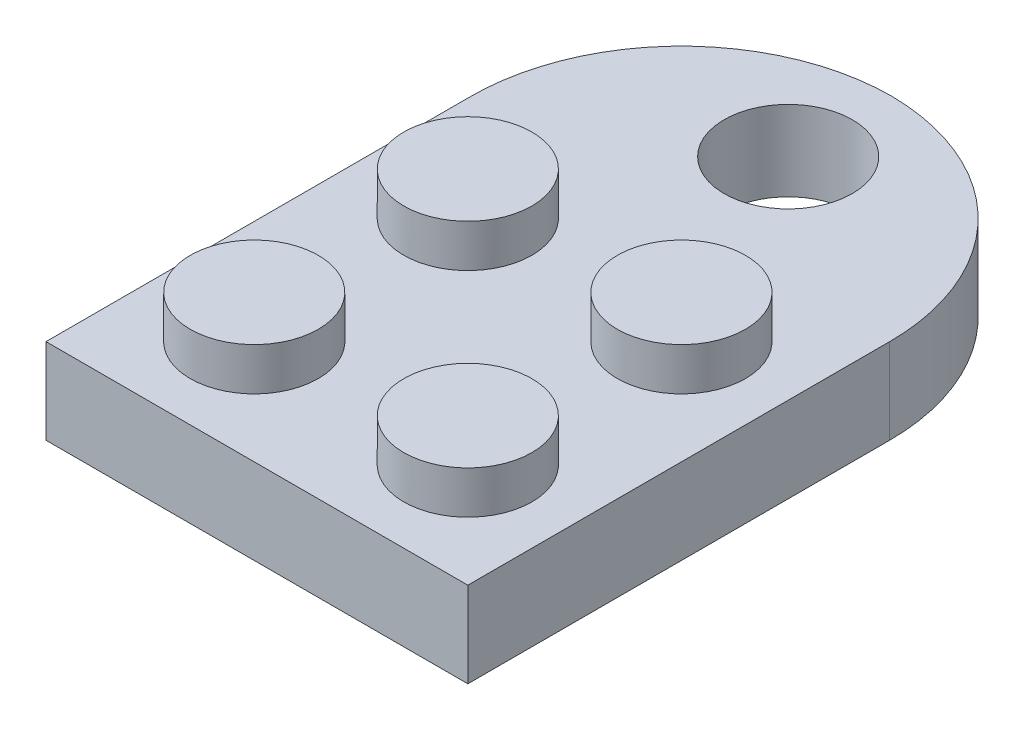
ISO-10303-21;
HEADER;
FILE_DESCRIPTION(('STEP AP214'),'2;1');
FILE_NAME('part.step','',(''),(''),'','','');
FILE_SCHEMA(('AUTOMOTIVE_DESIGN { 1 0 10303 214 1 1 1 1 }'));
ENDSEC;
DATA;
#1=APPLICATION_CONTEXT('core data for automotive mechanical design processes');
#2=APPLICATION_PROTOCOL_DEFINITION('international standard','automotive_design',2000,#1);
#3=PRODUCT_CONTEXT('',#1,'mechanical');
#4=PRODUCT('Part','Part','',(#3));
#5=PRODUCT_RELATED_PRODUCT_CATEGORY('part','',(#4));
#6=PRODUCT_DEFINITION_FORMATION('','',#4);
#7=PRODUCT_DEFINITION_CONTEXT('part definition',#1,'design');
#8=PRODUCT_DEFINITION('design','',#6,#7);
#9=PRODUCT_DEFINITION_SHAPE('','',#8);
#10=(LENGTH_UNIT() NAMED_UNIT(*) SI_UNIT(.MILLI.,.METRE.));
#11=(NAMED_UNIT(*) PLANE_ANGLE_UNIT() SI_UNIT($,.RADIAN.));
#12=(NAMED_UNIT(*) SI_UNIT($,.STERADIAN.) SOLID_ANGLE_UNIT());
#13=UNCERTAINTY_MEASURE_WITH_UNIT(LENGTH_MEASURE(1.E-05),#10,'distance_accuracy_value','');
#14=(GEOMETRIC_REPRESENTATION_CONTEXT(3) GLOBAL_UNCERTAINTY_ASSIGNED_CONTEXT((#13)) GLOBAL_UNIT_ASSIGNED_CONTEXT((#10,
#11,#12)) REPRESENTATION_CONTEXT('',''));
#15=CARTESIAN_POINT('',(0.,0.,0.));
#16=DIRECTION('',(0.,0.,1.));
#17=DIRECTION('',(1.,0.,0.));
#18=AXIS2_PLACEMENT_3D('',#15,#16,#17);
#19=CARTESIAN_POINT('',(9.2650879384945,2.4,-7.9));
#20=DIRECTION('',(0.,-1.,0.));
#21=DIRECTION('',(0.,0.,-1.));
#22=AXIS2_PLACEMENT_3D('',#19,#20,#21);
#23=PLANE('',#22);
#24=CARTESIAN_POINT('',(8.58196721311474,2.4,-12.));
#25=DIRECTION('',(0.,-1.,0.));
#26=DIRECTION('',(0.,0.,-1.));
#27=AXIS2_PLACEMENT_3D('',#24,#25,#26);
#28=CIRCLE('',#27,3.25);
#29=CARTESIAN_POINT('',(9.62071922922984,2.4,-15.0795282510503));
#30=VERTEX_POINT('',#29);
#31=CARTESIAN_POINT('',(7.54321519699964,2.4,-15.0795282510503));
#32=VERTEX_POINT('',#31);
#33=EDGE_CURVE('E174',#30,#32,#28,.T.);
#34=ORIENTED_EDGE('',*,*,#33,.F.);
#35=CARTESIAN_POINT('',(7.89884648773498,2.4,-7.9));
#36=DIRECTION('',(0.,1.,0.));
#37=DIRECTION('',(0.,0.,1.));
#38=AXIS2_PLACEMENT_3D('',#35,#36,#37);
#39=CIRCLE('',#38,7.38312072537976);
#40=CARTESIAN_POINT('',(15.2819672131147,2.4,-7.9));
#41=VERTEX_POINT('',#40);
#42=EDGE_CURVE('E188',#41,#30,#39,.T.);
#43=ORIENTED_EDGE('',*,*,#42,.F.);
#44=DIRECTION('',(-1.,0.,0.));
#45=VECTOR('',#44,1.);
#46=CARTESIAN_POINT('',(15.2819672131147,2.4,-7.9));
#47=LINE('',#46,#45);
#48=CARTESIAN_POINT('',(1.88196721311474,2.4,-7.9));
#49=VERTEX_POINT('',#48);
#50=EDGE_CURVE('E179',#41,#49,#47,.T.);
#51=ORIENTED_EDGE('',*,*,#50,.T.);
#52=CARTESIAN_POINT('',(9.2650879384945,2.4,-7.9));
#53=DIRECTION('',(0.,-1.,0.));
#54=DIRECTION('',(0.,0.,-1.));
#55=AXIS2_PLACEMENT_3D('',#52,#53,#54);
#56=CIRCLE('',#55,7.38312072537976);
#57=EDGE_CURVE('E184',#49,#32,#56,.T.);
#58=ORIENTED_EDGE('',*,*,#57,.T.);
#59=EDGE_LOOP('',(#34,#43,#51,#58));
#60=FACE_BOUND('',#59,.T.);
#61=ADVANCED_FACE('F41',(#60),#23,.T.);
#62=CARTESIAN_POINT('',(8.58196721311474,4.8,-12.));
#63=DIRECTION('',(0.,-1.,0.));
#64=DIRECTION('',(0.,0.,-1.));
#65=AXIS2_PLACEMENT_3D('',#62,#63,#64);
#66=CYLINDRICAL_SURFACE('',#65,2.4);
#67=CARTESIAN_POINT('',(8.58196721311474,3.2,-12.));
#68=DIRECTION('',(0.,-1.,0.));
#69=DIRECTION('',(1.,0.,0.));
#70=AXIS2_PLACEMENT_3D('',#67,#68,#69);
#71=CIRCLE('',#70,2.4);
#72=CARTESIAN_POINT('',(10.9819672131147,3.2,-12.));
#73=VERTEX_POINT('',#72);
#74=EDGE_CURVE('E199',#73,#73,#71,.T.);
#75=ORIENTED_EDGE('',*,*,#74,.F.);
#76=EDGE_LOOP('',(#75));
#77=FACE_BOUND('',#76,.T.);
#78=CARTESIAN_POINT('',(8.58196721311474,0.2,-12.));
#79=DIRECTION('',(0.,-1.,0.));
#80=DIRECTION('',(0.,0.,-1.));
#81=AXIS2_PLACEMENT_3D('',#78,#79,#80);
#82=CIRCLE('',#81,2.4);
#83=CARTESIAN_POINT('',(8.58196721311474,0.2,-14.4));
#84=VERTEX_POINT('',#83);
#85=EDGE_CURVE('E169',#84,#84,#82,.T.);
#86=ORIENTED_EDGE('',*,*,#85,.T.);
#87=EDGE_LOOP('',(#86));
#88=FACE_BOUND('',#87,.T.);
#89=ADVANCED_FACE('F357',(#77,#88),#66,.F.);
#90=CARTESIAN_POINT('',(0.681967213114738,0.,7.9));
#91=DIRECTION('',(0.,1.,0.));
#92=DIRECTION('',(0.,0.,1.));
#93=AXIS2_PLACEMENT_3D('',#90,#91,#92);
#94=PLANE('',#93);
#95=CARTESIAN_POINT('',(9.2650879384945,0.,-7.9));
#96=DIRECTION('',(0.,-1.,0.));
#97=DIRECTION('',(0.,0.,-1.));
#98=AXIS2_PLACEMENT_3D('',#95,#96,#97);
#99=CIRCLE('',#98,7.38312072537976);
#100=CARTESIAN_POINT('',(1.88196721311474,0.,-7.9));
#101=VERTEX_POINT('',#100);
#102=CARTESIAN_POINT('',(8.58196721311474,0.,-15.2514500420046));
#103=VERTEX_POINT('',#102);
#104=EDGE_CURVE('E192',#101,#103,#99,.T.);
#105=ORIENTED_EDGE('',*,*,#104,.F.);
#106=DIRECTION('',(-1.,0.,0.));
#107=VECTOR('',#106,1.);
#108=CARTESIAN_POINT('',(15.2819672131147,0.,-7.9));
#109=LINE('',#108,#107);
#110=CARTESIAN_POINT('',(15.2819672131147,0.,-7.9));
#111=VERTEX_POINT('',#110);
#112=EDGE_CURVE('E64',#111,#101,#109,.T.);
#113=ORIENTED_EDGE('',*,*,#112,.F.);
#114=CARTESIAN_POINT('',(7.89884648773498,0.,-7.9));
#115=DIRECTION('',(0.,1.,0.));
#116=DIRECTION('',(0.,0.,1.));
#117=AXIS2_PLACEMENT_3D('',#114,#115,#116);
#118=CIRCLE('',#117,7.38312072537976);
#119=EDGE_CURVE('E183',#111,#103,#118,.T.);
#120=ORIENTED_EDGE('',*,*,#119,.T.);
#121=EDGE_LOOP('',(#105,#113,#120));
#122=FACE_BOUND('',#121,.T.);
#123=DIRECTION('',(0.,0.,-1.));
#124=VECTOR('',#123,1.);
#125=CARTESIAN_POINT('',(0.681967213114738,0.,7.9));
#126=LINE('',#125,#124);
#127=CARTESIAN_POINT('',(0.681967213114738,0.,7.9));
#128=VERTEX_POINT('',#127);
#129=CARTESIAN_POINT('',(0.681967213114738,0.,-7.9));
#130=VERTEX_POINT('',#129);
#131=EDGE_CURVE('E305',#128,#130,#126,.T.);
#132=ORIENTED_EDGE('',*,*,#131,.T.);
#133=CARTESIAN_POINT('',(8.58196721311474,0.,-7.999375));
#134=DIRECTION('',(0.,1.,0.));
#135=DIRECTION('',(0.,0.,1.));
#136=AXIS2_PLACEMENT_3D('',#133,#134,#135);
#137=CIRCLE('',#136,7.900625);
#138=CARTESIAN_POINT('',(8.58196721311474,0.,-15.9));
#139=VERTEX_POINT('',#138);
#140=EDGE_CURVE('E203',#139,#130,#137,.T.);
#141=ORIENTED_EDGE('',*,*,#140,.F.);
#142=CARTESIAN_POINT('',(8.48133430172233,0.,-7.9));
#143=DIRECTION('',(0.,1.,0.));
#144=DIRECTION('',(0.,0.,1.));
#145=AXIS2_PLACEMENT_3D('',#142,#143,#144);
#146=CIRCLE('',#145,8.00063291139241);
#147=CARTESIAN_POINT('',(16.4819672131147,0.,-7.9));
#148=VERTEX_POINT('',#147);
#149=EDGE_CURVE('E205',#148,#139,#146,.T.);
#150=ORIENTED_EDGE('',*,*,#149,.F.);
#151=DIRECTION('',(0.,0.,-1.));
#152=VECTOR('',#151,1.);
#153=CARTESIAN_POINT('',(16.4819672131147,0.,7.9));
#154=LINE('',#153,#152);
#155=CARTESIAN_POINT('',(16.4819672131147,0.,7.9));
#156=VERTEX_POINT('',#155);
#157=EDGE_CURVE('E302',#156,#148,#154,.T.);
#158=ORIENTED_EDGE('',*,*,#157,.F.);
#159=DIRECTION('',(1.,0.,0.));
#160=VECTOR('',#159,1.);
#161=CARTESIAN_POINT('',(0.681967213114738,0.,7.9));
#162=LINE('',#161,#160);
#163=EDGE_CURVE('E285',#128,#156,#162,.T.);
#164=ORIENTED_EDGE('',*,*,#163,.F.);
#165=EDGE_LOOP('',(#132,#141,#150,#158,#164));
#166=FACE_BOUND('',#165,.T.);
#167=DIRECTION('',(1.,0.,0.));
#168=VECTOR('',#167,1.);
#169=CARTESIAN_POINT('',(0.,0.,-6.7));
#170=LINE('',#169,#168);
#171=CARTESIAN_POINT('',(1.88196721311474,0.,-6.7));
#172=VERTEX_POINT('',#171);
#173=CARTESIAN_POINT('',(15.2819672131147,0.,-6.7));
#174=VERTEX_POINT('',#173);
#175=EDGE_CURVE('E259',#172,#174,#170,.T.);
#176=ORIENTED_EDGE('',*,*,#175,.F.);
#177=DIRECTION('',(0.,0.,-1.));
#178=VECTOR('',#177,1.);
#179=CARTESIAN_POINT('',(1.88196721311474,0.,7.9));
#180=LINE('',#179,#178);
#181=CARTESIAN_POINT('',(1.88196721311474,0.,6.7));
#182=VERTEX_POINT('',#181);
#183=EDGE_CURVE('E237',#182,#172,#180,.T.);
#184=ORIENTED_EDGE('',*,*,#183,.F.);
#185=DIRECTION('',(1.,0.,0.));
#186=VECTOR('',#185,1.);
#187=CARTESIAN_POINT('',(0.,0.,6.7));
#188=LINE('',#187,#186);
#189=CARTESIAN_POINT('',(15.2819672131147,0.,6.7));
#190=VERTEX_POINT('',#189);
#191=EDGE_CURVE('E262',#182,#190,#188,.T.);
#192=ORIENTED_EDGE('',*,*,#191,.T.);
#193=DIRECTION('',(0.,0.,-1.));
#194=VECTOR('',#193,1.);
#195=CARTESIAN_POINT('',(15.2819672131147,0.,7.9));
#196=LINE('',#195,#194);
#197=EDGE_CURVE('E251',#190,#174,#196,.T.);
#198=ORIENTED_EDGE('',*,*,#197,.T.);
#199=EDGE_LOOP('',(#176,#184,#192,#198));
#200=FACE_BOUND('',#199,.T.);
#201=ADVANCED_FACE('F348',(#122,#166,#200),#94,.F.);
#202=CARTESIAN_POINT('',(12.5819672131147,4.8,4.));
#203=DIRECTION('',(0.,1.,0.));
#204=DIRECTION('',(0.,0.,1.));
#205=AXIS2_PLACEMENT_3D('',#202,#203,#204);
#206=PLANE('',#205);
#207=CARTESIAN_POINT('',(12.5819672131147,4.8,4.));
#208=DIRECTION('',(0.,1.,0.));
#209=DIRECTION('',(0.,0.,1.));
#210=AXIS2_PLACEMENT_3D('',#207,#208,#209);
#211=CIRCLE('',#210,2.4);
#212=CARTESIAN_POINT('',(12.5819672131147,4.8,6.4));
#213=VERTEX_POINT('',#212);
#214=EDGE_CURVE('E323',#213,#213,#211,.T.);
#215=ORIENTED_EDGE('',*,*,#214,.T.);
#216=EDGE_LOOP('',(#215));
#217=FACE_BOUND('',#216,.T.);
#218=ADVANCED_FACE('F43',(#217),#206,.T.);
#219=CARTESIAN_POINT('',(12.5819672131147,4.8,4.));
#220=DIRECTION('',(0.,-1.,0.));
#221=DIRECTION('',(0.,0.,-1.));
#222=AXIS2_PLACEMENT_3D('',#219,#220,#221);
#223=CYLINDRICAL_SURFACE('',#222,2.4);
#224=ORIENTED_EDGE('',*,*,#214,.F.);
#225=EDGE_LOOP('',(#224));
#226=FACE_BOUND('',#225,.T.);
#227=CARTESIAN_POINT('',(12.5819672131147,3.2,4.));
#228=DIRECTION('',(0.,-1.,0.));
#229=DIRECTION('',(1.,0.,0.));
#230=AXIS2_PLACEMENT_3D('',#227,#228,#229);
#231=CIRCLE('',#230,2.4);
#232=CARTESIAN_POINT('',(14.9819672131147,3.2,4.));
#233=VERTEX_POINT('',#232);
#234=EDGE_CURVE('E320',#233,#233,#231,.F.);
#235=ORIENTED_EDGE('',*,*,#234,.T.);
#236=EDGE_LOOP('',(#235));
#237=FACE_BOUND('',#236,.T.);
#238=ADVANCED_FACE('F499',(#226,#237),#223,.T.);
#239=CARTESIAN_POINT('',(12.5819672131147,4.8,-4.));
#240=DIRECTION('',(0.,1.,0.));
#241=DIRECTION('',(0.,0.,1.));
#242=AXIS2_PLACEMENT_3D('',#239,#240,#241);
#243=PLANE('',#242);
#244=CARTESIAN_POINT('',(12.5819672131147,4.8,-4.));
#245=DIRECTION('',(0.,1.,0.));
#246=DIRECTION('',(0.,0.,1.));
#247=AXIS2_PLACEMENT_3D('',#244,#245,#246);
#248=CIRCLE('',#247,2.4);
#249=CARTESIAN_POINT('',(12.5819672131147,4.8,-1.6));
#250=VERTEX_POINT('',#249);
#251=EDGE_CURVE('E317',#250,#250,#248,.T.);
#252=ORIENTED_EDGE('',*,*,#251,.T.);
#253=EDGE_LOOP('',(#252));
#254=FACE_BOUND('',#253,.T.);
#255=ADVANCED_FACE('F496',(#254),#243,.T.);
#256=CARTESIAN_POINT('',(12.5819672131147,4.8,-4.));
#257=DIRECTION('',(0.,-1.,0.));
#258=DIRECTION('',(0.,0.,-1.));
#259=AXIS2_PLACEMENT_3D('',#256,#257,#258);
#260=CYLINDRICAL_SURFACE('',#259,2.4);
#261=ORIENTED_EDGE('',*,*,#251,.F.);
#262=EDGE_LOOP('',(#261));
#263=FACE_BOUND('',#262,.T.);
#264=CARTESIAN_POINT('',(12.5819672131147,3.2,-4.));
#265=DIRECTION('',(0.,-1.,0.));
#266=DIRECTION('',(1.,0.,0.));
#267=AXIS2_PLACEMENT_3D('',#264,#265,#266);
#268=CIRCLE('',#267,2.4);
#269=CARTESIAN_POINT('',(14.9819672131147,3.2,-4.));
#270=VERTEX_POINT('',#269);
#271=EDGE_CURVE('E314',#270,#270,#268,.F.);
#272=ORIENTED_EDGE('',*,*,#271,.T.);
#273=EDGE_LOOP('',(#272));
#274=FACE_BOUND('',#273,.T.);
#275=ADVANCED_FACE('F492',(#263,#274),#260,.T.);
#276=CARTESIAN_POINT('',(0.681967213114738,0.,7.9));
#277=DIRECTION('',(1.,0.,0.));
#278=DIRECTION('',(0.,0.,-1.));
#279=AXIS2_PLACEMENT_3D('',#276,#277,#278);
#280=PLANE('',#279);
#281=DIRECTION('',(0.,-1.,0.));
#282=VECTOR('',#281,1.);
#283=CARTESIAN_POINT('',(0.681967213114738,0.,-7.9));
#284=LINE('',#283,#282);
#285=CARTESIAN_POINT('',(0.681967213114738,3.2,-7.9));
#286=VERTEX_POINT('',#285);
#287=EDGE_CURVE('E281',#286,#130,#284,.T.);
#288=ORIENTED_EDGE('',*,*,#287,.T.);
#289=ORIENTED_EDGE('',*,*,#131,.F.);
#290=DIRECTION('',(0.,-1.,0.));
#291=VECTOR('',#290,1.);
#292=CARTESIAN_POINT('',(0.681967213114738,0.,7.9));
#293=LINE('',#292,#291);
#294=CARTESIAN_POINT('',(0.681967213114738,3.2,7.9));
#295=VERTEX_POINT('',#294);
#296=EDGE_CURVE('E282',#295,#128,#293,.T.);
#297=ORIENTED_EDGE('',*,*,#296,.F.);
#298=DIRECTION('',(0.,0.,-1.));
#299=VECTOR('',#298,1.);
#300=CARTESIAN_POINT('',(0.681967213114738,3.2,7.9));
#301=LINE('',#300,#299);
#302=EDGE_CURVE('E292',#295,#286,#301,.T.);
#303=ORIENTED_EDGE('',*,*,#302,.T.);
#304=EDGE_LOOP('',(#288,#289,#297,#303));
#305=FACE_BOUND('',#304,.T.);
#306=ADVANCED_FACE('F486',(#305),#280,.F.);
#307=CARTESIAN_POINT('',(16.4819672131147,0.,7.9));
#308=DIRECTION('',(-1.,0.,0.));
#309=DIRECTION('',(0.,0.,1.));
#310=AXIS2_PLACEMENT_3D('',#307,#308,#309);
#311=PLANE('',#310);
#312=DIRECTION('',(0.,1.,0.));
#313=VECTOR('',#312,1.);
#314=CARTESIAN_POINT('',(16.4819672131147,0.,-7.9));
#315=LINE('',#314,#313);
#316=CARTESIAN_POINT('',(16.4819672131147,3.2,-7.9));
#317=VERTEX_POINT('',#316);
#318=EDGE_CURVE('E286',#148,#317,#315,.T.);
#319=ORIENTED_EDGE('',*,*,#318,.T.);
#320=DIRECTION('',(0.,0.,-1.));
#321=VECTOR('',#320,1.);
#322=CARTESIAN_POINT('',(16.4819672131147,3.2,7.9));
#323=LINE('',#322,#321);
#324=CARTESIAN_POINT('',(16.4819672131147,3.2,7.9));
#325=VERTEX_POINT('',#324);
#326=EDGE_CURVE('E299',#325,#317,#323,.T.);
#327=ORIENTED_EDGE('',*,*,#326,.F.);
#328=DIRECTION('',(0.,1.,0.));
#329=VECTOR('',#328,1.);
#330=CARTESIAN_POINT('',(16.4819672131147,0.,7.9));
#331=LINE('',#330,#329);
#332=EDGE_CURVE('E288',#156,#325,#331,.T.);
#333=ORIENTED_EDGE('',*,*,#332,.F.);
#334=ORIENTED_EDGE('',*,*,#157,.T.);
#335=EDGE_LOOP('',(#319,#327,#333,#334));
#336=FACE_BOUND('',#335,.T.);
#337=ADVANCED_FACE('F483',(#336),#311,.F.);
#338=CARTESIAN_POINT('',(0.681967213114738,3.2,7.9));
#339=DIRECTION('',(0.,-1.,0.));
#340=DIRECTION('',(1.,0.,0.));
#341=AXIS2_PLACEMENT_3D('',#338,#339,#340);
#342=PLANE('',#341);
#343=ORIENTED_EDGE('',*,*,#74,.T.);
#344=EDGE_LOOP('',(#343));
#345=FACE_BOUND('',#344,.T.);
#346=CARTESIAN_POINT('',(4.58196721311474,3.2,4.));
#347=DIRECTION('',(0.,-1.,0.));
#348=DIRECTION('',(1.,0.,0.));
#349=AXIS2_PLACEMENT_3D('',#346,#347,#348);
#350=CIRCLE('',#349,2.4);
#351=CARTESIAN_POINT('',(6.98196721311474,3.2,4.));
#352=VERTEX_POINT('',#351);
#353=EDGE_CURVE('E311',#352,#352,#350,.F.);
#354=ORIENTED_EDGE('',*,*,#353,.F.);
#355=EDGE_LOOP('',(#354));
#356=FACE_BOUND('',#355,.T.);
#357=CARTESIAN_POINT('',(4.58196721311474,3.2,-4.));
#358=DIRECTION('',(0.,-1.,0.));
#359=DIRECTION('',(1.,0.,0.));
#360=AXIS2_PLACEMENT_3D('',#357,#358,#359);
#361=CIRCLE('',#360,2.4);
#362=CARTESIAN_POINT('',(6.98196721311474,3.2,-4.));
#363=VERTEX_POINT('',#362);
#364=EDGE_CURVE('E308',#363,#363,#361,.F.);
#365=ORIENTED_EDGE('',*,*,#364,.F.);
#366=EDGE_LOOP('',(#365));
#367=FACE_BOUND('',#366,.T.);
#368=ORIENTED_EDGE('',*,*,#326,.T.);
#369=CARTESIAN_POINT('',(8.48133430172233,3.2,-7.9));
#370=DIRECTION('',(0.,1.,0.));
#371=DIRECTION('',(0.,0.,1.));
#372=AXIS2_PLACEMENT_3D('',#369,#370,#371);
#373=CIRCLE('',#372,8.00063291139241);
#374=CARTESIAN_POINT('',(8.58196721311474,3.2,-15.9));
#375=VERTEX_POINT('',#374);
#376=EDGE_CURVE('E208',#317,#375,#373,.T.);
#377=ORIENTED_EDGE('',*,*,#376,.T.);
#378=CARTESIAN_POINT('',(8.58196721311474,3.2,-7.999375));
#379=DIRECTION('',(0.,1.,0.));
#380=DIRECTION('',(0.,0.,1.));
#381=AXIS2_PLACEMENT_3D('',#378,#379,#380);
#382=CIRCLE('',#381,7.900625);
#383=EDGE_CURVE('E206',#375,#286,#382,.T.);
#384=ORIENTED_EDGE('',*,*,#383,.T.);
#385=ORIENTED_EDGE('',*,*,#302,.F.);
#386=DIRECTION('',(-1.,0.,0.));
#387=VECTOR('',#386,1.);
#388=CARTESIAN_POINT('',(0.681967213114738,3.2,7.9));
#389=LINE('',#388,#387);
#390=EDGE_CURVE('E290',#325,#295,#389,.T.);
#391=ORIENTED_EDGE('',*,*,#390,.F.);
#392=EDGE_LOOP('',(#368,#377,#384,#385,#391));
#393=FACE_BOUND('',#392,.T.);
#394=ORIENTED_EDGE('',*,*,#271,.F.);
#395=EDGE_LOOP('',(#394));
#396=FACE_BOUND('',#395,.T.);
#397=ORIENTED_EDGE('',*,*,#234,.F.);
#398=EDGE_LOOP('',(#397));
#399=FACE_BOUND('',#398,.T.);
#400=ADVANCED_FACE('F479',(#345,#356,#367,#393,#396,#399),#342,.F.);
#401=CARTESIAN_POINT('',(0.,0.,7.9));
#402=DIRECTION('',(0.,0.,-1.));
#403=DIRECTION('',(-1.,0.,0.));
#404=AXIS2_PLACEMENT_3D('',#401,#402,#403);
#405=PLANE('',#404);
#406=ORIENTED_EDGE('',*,*,#296,.T.);
#407=ORIENTED_EDGE('',*,*,#163,.T.);
#408=ORIENTED_EDGE('',*,*,#332,.T.);
#409=ORIENTED_EDGE('',*,*,#390,.T.);
#410=EDGE_LOOP('',(#406,#407,#408,#409));
#411=FACE_BOUND('',#410,.T.);
#412=ADVANCED_FACE('F475',(#411),#405,.F.);
#413=CARTESIAN_POINT('',(4.58196721311474,4.8,-4.));
#414=DIRECTION('',(0.,-1.,0.));
#415=DIRECTION('',(0.,0.,-1.));
#416=AXIS2_PLACEMENT_3D('',#413,#414,#415);
#417=CYLINDRICAL_SURFACE('',#416,2.4);
#418=CARTESIAN_POINT('',(4.58196721311474,4.8,-4.));
#419=DIRECTION('',(0.,1.,0.));
#420=DIRECTION('',(0.,0.,1.));
#421=AXIS2_PLACEMENT_3D('',#418,#419,#420);
#422=CIRCLE('',#421,2.4);
#423=CARTESIAN_POINT('',(4.58196721311474,4.8,-1.6));
#424=VERTEX_POINT('',#423);
#425=EDGE_CURVE('E278',#424,#424,#422,.T.);
#426=ORIENTED_EDGE('',*,*,#425,.F.);
#427=EDGE_LOOP('',(#426));
#428=FACE_BOUND('',#427,.T.);
#429=ORIENTED_EDGE('',*,*,#364,.T.);
#430=EDGE_LOOP('',(#429));
#431=FACE_BOUND('',#430,.T.);
#432=ADVANCED_FACE('F471',(#428,#431),#417,.T.);
#433=CARTESIAN_POINT('',(4.58196721311474,4.8,-4.));
#434=DIRECTION('',(0.,1.,0.));
#435=DIRECTION('',(0.,0.,1.));
#436=AXIS2_PLACEMENT_3D('',#433,#434,#435);
#437=PLANE('',#436);
#438=ORIENTED_EDGE('',*,*,#425,.T.);
#439=EDGE_LOOP('',(#438));
#440=FACE_BOUND('',#439,.T.);
#441=ADVANCED_FACE('F467',(#440),#437,.T.);
#442=CARTESIAN_POINT('',(4.58196721311474,4.8,4.));
#443=DIRECTION('',(0.,-1.,0.));
#444=DIRECTION('',(0.,0.,-1.));
#445=AXIS2_PLACEMENT_3D('',#442,#443,#444);
#446=CYLINDRICAL_SURFACE('',#445,2.4);
#447=CARTESIAN_POINT('',(4.58196721311474,4.8,4.));
#448=DIRECTION('',(0.,1.,0.));
#449=DIRECTION('',(0.,0.,1.));
#450=AXIS2_PLACEMENT_3D('',#447,#448,#449);
#451=CIRCLE('',#450,2.4);
#452=CARTESIAN_POINT('',(4.58196721311474,4.8,6.4));
#453=VERTEX_POINT('',#452);
#454=EDGE_CURVE('E225',#453,#453,#451,.T.);
#455=ORIENTED_EDGE('',*,*,#454,.F.);
#456=EDGE_LOOP('',(#455));
#457=FACE_BOUND('',#456,.T.);
#458=ORIENTED_EDGE('',*,*,#353,.T.);
#459=EDGE_LOOP('',(#458));
#460=FACE_BOUND('',#459,.T.);
#461=ADVANCED_FACE('F463',(#457,#460),#446,.T.);
#462=CARTESIAN_POINT('',(4.58196721311474,4.8,4.));
#463=DIRECTION('',(0.,1.,0.));
#464=DIRECTION('',(0.,0.,1.));
#465=AXIS2_PLACEMENT_3D('',#462,#463,#464);
#466=PLANE('',#465);
#467=ORIENTED_EDGE('',*,*,#454,.T.);
#468=EDGE_LOOP('',(#467));
#469=FACE_BOUND('',#468,.T.);
#470=ADVANCED_FACE('F415',(#469),#466,.T.);
#471=CARTESIAN_POINT('',(12.5819672131147,3.6,4.));
#472=DIRECTION('',(0.,1.,0.));
#473=DIRECTION('',(0.,0.,1.));
#474=AXIS2_PLACEMENT_3D('',#471,#472,#473);
#475=PLANE('',#474);
#476=CARTESIAN_POINT('',(12.5819672131147,3.6,4.));
#477=DIRECTION('',(0.,1.,0.));
#478=DIRECTION('',(0.,0.,1.));
#479=AXIS2_PLACEMENT_3D('',#476,#477,#478);
#480=CIRCLE('',#479,1.2);
#481=CARTESIAN_POINT('',(12.5819672131147,3.6,5.2));
#482=VERTEX_POINT('',#481);
#483=EDGE_CURVE('E222',#482,#482,#480,.T.);
#484=ORIENTED_EDGE('',*,*,#483,.F.);
#485=EDGE_LOOP('',(#484));
#486=FACE_BOUND('',#485,.T.);
#487=ADVANCED_FACE('F411',(#486),#475,.F.);
#488=CARTESIAN_POINT('',(12.5819672131147,4.8,4.));
#489=DIRECTION('',(0.,-1.,0.));
#490=DIRECTION('',(0.,0.,-1.));
#491=AXIS2_PLACEMENT_3D('',#488,#489,#490);
#492=CYLINDRICAL_SURFACE('',#491,1.2);
#493=ORIENTED_EDGE('',*,*,#483,.T.);
#494=EDGE_LOOP('',(#493));
#495=FACE_BOUND('',#494,.T.);
#496=CARTESIAN_POINT('',(12.5819672131147,2.,4.));
#497=DIRECTION('',(0.,-1.,0.));
#498=DIRECTION('',(1.,0.,0.));
#499=AXIS2_PLACEMENT_3D('',#496,#497,#498);
#500=CIRCLE('',#499,1.2);
#501=CARTESIAN_POINT('',(13.7819672131147,2.,4.));
#502=VERTEX_POINT('',#501);
#503=EDGE_CURVE('E226',#502,#502,#500,.F.);
#504=ORIENTED_EDGE('',*,*,#503,.F.);
#505=EDGE_LOOP('',(#504));
#506=FACE_BOUND('',#505,.T.);
#507=ADVANCED_FACE('F414',(#495,#506),#492,.F.);
#508=CARTESIAN_POINT('',(12.5819672131147,3.6,-4.));
#509=DIRECTION('',(0.,1.,0.));
#510=DIRECTION('',(0.,0.,1.));
#511=AXIS2_PLACEMENT_3D('',#508,#509,#510);
#512=PLANE('',#511);
#513=CARTESIAN_POINT('',(12.5819672131147,3.6,-4.));
#514=DIRECTION('',(0.,1.,0.));
#515=DIRECTION('',(0.,0.,1.));
#516=AXIS2_PLACEMENT_3D('',#513,#514,#515);
#517=CIRCLE('',#516,1.2);
#518=CARTESIAN_POINT('',(12.5819672131147,3.6,-2.8));
#519=VERTEX_POINT('',#518);
#520=EDGE_CURVE('E229',#519,#519,#517,.T.);
#521=ORIENTED_EDGE('',*,*,#520,.F.);
#522=EDGE_LOOP('',(#521));
#523=FACE_BOUND('',#522,.T.);
#524=ADVANCED_FACE('F419',(#523),#512,.F.);
#525=CARTESIAN_POINT('',(12.5819672131147,4.8,-4.));
#526=DIRECTION('',(0.,-1.,0.));
#527=DIRECTION('',(0.,0.,-1.));
#528=AXIS2_PLACEMENT_3D('',#525,#526,#527);
#529=CYLINDRICAL_SURFACE('',#528,1.2);
#530=ORIENTED_EDGE('',*,*,#520,.T.);
#531=EDGE_LOOP('',(#530));
#532=FACE_BOUND('',#531,.T.);
#533=CARTESIAN_POINT('',(12.5819672131147,2.,-4.));
#534=DIRECTION('',(0.,-1.,0.));
#535=DIRECTION('',(1.,0.,0.));
#536=AXIS2_PLACEMENT_3D('',#533,#534,#535);
#537=CIRCLE('',#536,1.2);
#538=CARTESIAN_POINT('',(13.7819672131147,2.,-4.));
#539=VERTEX_POINT('',#538);
#540=EDGE_CURVE('E233',#539,#539,#537,.F.);
#541=ORIENTED_EDGE('',*,*,#540,.F.);
#542=EDGE_LOOP('',(#541));
#543=FACE_BOUND('',#542,.T.);
#544=ADVANCED_FACE('F423',(#532,#543),#529,.F.);
#545=CARTESIAN_POINT('',(1.88196721311474,0.,7.9));
#546=DIRECTION('',(1.,0.,0.));
#547=DIRECTION('',(0.,0.,-1.));
#548=AXIS2_PLACEMENT_3D('',#545,#546,#547);
#549=PLANE('',#548);
#550=DIRECTION('',(0.,-1.,0.));
#551=VECTOR('',#550,1.);
#552=CARTESIAN_POINT('',(1.88196721311474,0.,-6.7));
#553=LINE('',#552,#551);
#554=CARTESIAN_POINT('',(1.88196721311474,2.,-6.7));
#555=VERTEX_POINT('',#554);
#556=EDGE_CURVE('E256',#555,#172,#553,.T.);
#557=ORIENTED_EDGE('',*,*,#556,.F.);
#558=DIRECTION('',(0.,0.,-1.));
#559=VECTOR('',#558,1.);
#560=CARTESIAN_POINT('',(1.88196721311474,2.,7.9));
#561=LINE('',#560,#559);
#562=CARTESIAN_POINT('',(1.88196721311474,2.,6.7));
#563=VERTEX_POINT('',#562);
#564=EDGE_CURVE('E242',#563,#555,#561,.T.);
#565=ORIENTED_EDGE('',*,*,#564,.F.);
#566=DIRECTION('',(0.,-1.,0.));
#567=VECTOR('',#566,1.);
#568=CARTESIAN_POINT('',(1.88196721311474,0.,6.7));
#569=LINE('',#568,#567);
#570=EDGE_CURVE('E240',#563,#182,#569,.T.);
#571=ORIENTED_EDGE('',*,*,#570,.T.);
#572=ORIENTED_EDGE('',*,*,#183,.T.);
#573=EDGE_LOOP('',(#557,#565,#571,#572));
#574=FACE_BOUND('',#573,.T.);
#575=ADVANCED_FACE('F427',(#574),#549,.T.);
#576=CARTESIAN_POINT('',(15.2819672131147,0.,7.9));
#577=DIRECTION('',(-1.,0.,0.));
#578=DIRECTION('',(0.,0.,1.));
#579=AXIS2_PLACEMENT_3D('',#576,#577,#578);
#580=PLANE('',#579);
#581=DIRECTION('',(0.,1.,0.));
#582=VECTOR('',#581,1.);
#583=CARTESIAN_POINT('',(15.2819672131147,0.,-6.7));
#584=LINE('',#583,#582);
#585=CARTESIAN_POINT('',(15.2819672131147,2.,-6.7));
#586=VERTEX_POINT('',#585);
#587=EDGE_CURVE('E241',#174,#586,#584,.T.);
#588=ORIENTED_EDGE('',*,*,#587,.F.);
#589=ORIENTED_EDGE('',*,*,#197,.F.);
#590=DIRECTION('',(0.,1.,0.));
#591=VECTOR('',#590,1.);
#592=CARTESIAN_POINT('',(15.2819672131147,0.,6.7));
#593=LINE('',#592,#591);
#594=CARTESIAN_POINT('',(15.2819672131147,2.,6.7));
#595=VERTEX_POINT('',#594);
#596=EDGE_CURVE('E248',#190,#595,#593,.T.);
#597=ORIENTED_EDGE('',*,*,#596,.T.);
#598=DIRECTION('',(0.,0.,-1.));
#599=VECTOR('',#598,1.);
#600=CARTESIAN_POINT('',(15.2819672131147,2.,7.9));
#601=LINE('',#600,#599);
#602=EDGE_CURVE('E245',#595,#586,#601,.T.);
#603=ORIENTED_EDGE('',*,*,#602,.T.);
#604=EDGE_LOOP('',(#588,#589,#597,#603));
#605=FACE_BOUND('',#604,.T.);
#606=ADVANCED_FACE('F431',(#605),#580,.T.);
#607=CARTESIAN_POINT('',(0.681967213114738,2.,7.9));
#608=DIRECTION('',(0.,-1.,0.));
#609=DIRECTION('',(1.,0.,0.));
#610=AXIS2_PLACEMENT_3D('',#607,#608,#609);
#611=PLANE('',#610);
#612=CARTESIAN_POINT('',(8.58196721311474,2.,0.));
#613=DIRECTION('',(0.,-1.,0.));
#614=DIRECTION('',(1.,0.,0.));
#615=AXIS2_PLACEMENT_3D('',#612,#613,#614);
#616=CIRCLE('',#615,3.15);
#617=CARTESIAN_POINT('',(11.7319672131147,2.,0.));
#618=VERTEX_POINT('',#617);
#619=EDGE_CURVE('E221',#618,#618,#616,.F.);
#620=ORIENTED_EDGE('',*,*,#619,.T.);
#621=EDGE_LOOP('',(#620));
#622=FACE_BOUND('',#621,.T.);
#623=CARTESIAN_POINT('',(4.58196721311474,2.,4.));
#624=DIRECTION('',(0.,-1.,0.));
#625=DIRECTION('',(1.,0.,0.));
#626=AXIS2_PLACEMENT_3D('',#623,#624,#625);
#627=CIRCLE('',#626,1.2);
#628=CARTESIAN_POINT('',(5.78196721311474,2.,4.));
#629=VERTEX_POINT('',#628);
#630=EDGE_CURVE('E230',#629,#629,#627,.F.);
#631=ORIENTED_EDGE('',*,*,#630,.T.);
#632=EDGE_LOOP('',(#631));
#633=FACE_BOUND('',#632,.T.);
#634=CARTESIAN_POINT('',(4.58196721311474,2.,-4.));
#635=DIRECTION('',(0.,-1.,0.));
#636=DIRECTION('',(1.,0.,0.));
#637=AXIS2_PLACEMENT_3D('',#634,#635,#636);
#638=CIRCLE('',#637,1.2);
#639=CARTESIAN_POINT('',(5.78196721311474,2.,-4.));
#640=VERTEX_POINT('',#639);
#641=EDGE_CURVE('E234',#640,#640,#638,.F.);
#642=ORIENTED_EDGE('',*,*,#641,.T.);
#643=EDGE_LOOP('',(#642));
#644=FACE_BOUND('',#643,.T.);
#645=DIRECTION('',(-1.,0.,0.));
#646=VECTOR('',#645,1.);
#647=CARTESIAN_POINT('',(0.,2.,-6.7));
#648=LINE('',#647,#646);
#649=EDGE_CURVE('E238',#586,#555,#648,.T.);
#650=ORIENTED_EDGE('',*,*,#649,.F.);
#651=ORIENTED_EDGE('',*,*,#602,.F.);
#652=DIRECTION('',(-1.,0.,0.));
#653=VECTOR('',#652,1.);
#654=CARTESIAN_POINT('',(0.,2.,6.7));
#655=LINE('',#654,#653);
#656=EDGE_CURVE('E246',#595,#563,#655,.T.);
#657=ORIENTED_EDGE('',*,*,#656,.T.);
#658=ORIENTED_EDGE('',*,*,#564,.T.);
#659=EDGE_LOOP('',(#650,#651,#657,#658));
#660=FACE_BOUND('',#659,.T.);
#661=ORIENTED_EDGE('',*,*,#540,.T.);
#662=EDGE_LOOP('',(#661));
#663=FACE_BOUND('',#662,.T.);
#664=ORIENTED_EDGE('',*,*,#503,.T.);
#665=EDGE_LOOP('',(#664));
#666=FACE_BOUND('',#665,.T.);
#667=ADVANCED_FACE('F396',(#622,#633,#644,#660,#663,#666),#611,.T.);
#668=CARTESIAN_POINT('',(0.,0.,6.7));
#669=DIRECTION('',(0.,0.,-1.));
#670=DIRECTION('',(-1.,0.,0.));
#671=AXIS2_PLACEMENT_3D('',#668,#669,#670);
#672=PLANE('',#671);
#673=ORIENTED_EDGE('',*,*,#570,.F.);
#674=ORIENTED_EDGE('',*,*,#656,.F.);
#675=ORIENTED_EDGE('',*,*,#596,.F.);
#676=ORIENTED_EDGE('',*,*,#191,.F.);
#677=EDGE_LOOP('',(#673,#674,#675,#676));
#678=FACE_BOUND('',#677,.T.);
#679=ADVANCED_FACE('F437',(#678),#672,.T.);
#680=CARTESIAN_POINT('',(0.,0.,-6.7));
#681=DIRECTION('',(0.,0.,-1.));
#682=DIRECTION('',(-1.,0.,0.));
#683=AXIS2_PLACEMENT_3D('',#680,#681,#682);
#684=PLANE('',#683);
#685=ORIENTED_EDGE('',*,*,#556,.T.);
#686=ORIENTED_EDGE('',*,*,#175,.T.);
#687=ORIENTED_EDGE('',*,*,#587,.T.);
#688=ORIENTED_EDGE('',*,*,#649,.T.);
#689=EDGE_LOOP('',(#685,#686,#687,#688));
#690=FACE_BOUND('',#689,.T.);
#691=ADVANCED_FACE('F441',(#690),#684,.F.);
#692=CARTESIAN_POINT('',(4.58196721311474,4.8,-4.));
#693=DIRECTION('',(0.,-1.,0.));
#694=DIRECTION('',(0.,0.,-1.));
#695=AXIS2_PLACEMENT_3D('',#692,#693,#694);
#696=CYLINDRICAL_SURFACE('',#695,1.2);
#697=CARTESIAN_POINT('',(4.58196721311474,3.6,-4.));
#698=DIRECTION('',(0.,1.,0.));
#699=DIRECTION('',(0.,0.,1.));
#700=AXIS2_PLACEMENT_3D('',#697,#698,#699);
#701=CIRCLE('',#700,1.2);
#702=CARTESIAN_POINT('',(4.58196721311474,3.6,-2.8));
#703=VERTEX_POINT('',#702);
#704=EDGE_CURVE('E260',#703,#703,#701,.T.);
#705=ORIENTED_EDGE('',*,*,#704,.T.);
#706=EDGE_LOOP('',(#705));
#707=FACE_BOUND('',#706,.T.);
#708=ORIENTED_EDGE('',*,*,#641,.F.);
#709=EDGE_LOOP('',(#708));
#710=FACE_BOUND('',#709,.T.);
#711=ADVANCED_FACE('F445',(#707,#710),#696,.F.);
#712=CARTESIAN_POINT('',(4.58196721311474,3.6,-4.));
#713=DIRECTION('',(0.,1.,0.));
#714=DIRECTION('',(0.,0.,1.));
#715=AXIS2_PLACEMENT_3D('',#712,#713,#714);
#716=PLANE('',#715);
#717=ORIENTED_EDGE('',*,*,#704,.F.);
#718=EDGE_LOOP('',(#717));
#719=FACE_BOUND('',#718,.T.);
#720=ADVANCED_FACE('F449',(#719),#716,.F.);
#721=CARTESIAN_POINT('',(4.58196721311474,4.8,4.));
#722=DIRECTION('',(0.,-1.,0.));
#723=DIRECTION('',(0.,0.,-1.));
#724=AXIS2_PLACEMENT_3D('',#721,#722,#723);
#725=CYLINDRICAL_SURFACE('',#724,1.2);
#726=CARTESIAN_POINT('',(4.58196721311474,3.6,4.));
#727=DIRECTION('',(0.,1.,0.));
#728=DIRECTION('',(0.,0.,1.));
#729=AXIS2_PLACEMENT_3D('',#726,#727,#728);
#730=CIRCLE('',#729,1.2);
#731=CARTESIAN_POINT('',(4.58196721311474,3.6,5.2));
#732=VERTEX_POINT('',#731);
#733=EDGE_CURVE('E267',#732,#732,#730,.T.);
#734=ORIENTED_EDGE('',*,*,#733,.T.);
#735=EDGE_LOOP('',(#734));
#736=FACE_BOUND('',#735,.T.);
#737=ORIENTED_EDGE('',*,*,#630,.F.);
#738=EDGE_LOOP('',(#737));
#739=FACE_BOUND('',#738,.T.);
#740=ADVANCED_FACE('F453',(#736,#739),#725,.F.);
#741=CARTESIAN_POINT('',(4.58196721311474,3.6,4.));
#742=DIRECTION('',(0.,1.,0.));
#743=DIRECTION('',(0.,0.,1.));
#744=AXIS2_PLACEMENT_3D('',#741,#742,#743);
#745=PLANE('',#744);
#746=ORIENTED_EDGE('',*,*,#733,.F.);
#747=EDGE_LOOP('',(#746));
#748=FACE_BOUND('',#747,.T.);
#749=ADVANCED_FACE('F406',(#748),#745,.F.);
#750=CARTESIAN_POINT('',(8.58196721311474,0.6,0.));
#751=DIRECTION('',(0.,-1.,0.));
#752=DIRECTION('',(0.,0.,-1.));
#753=AXIS2_PLACEMENT_3D('',#750,#751,#752);
#754=PLANE('',#753);
#755=CARTESIAN_POINT('',(8.58196721311474,0.6,0.));
#756=DIRECTION('',(0.,-1.,0.));
#757=DIRECTION('',(0.,0.,-1.));
#758=AXIS2_PLACEMENT_3D('',#755,#756,#757);
#759=CIRCLE('',#758,3.15);
#760=CARTESIAN_POINT('',(8.58196721311474,0.6,-3.15));
#761=VERTEX_POINT('',#760);
#762=EDGE_CURVE('E218',#761,#761,#759,.T.);
#763=ORIENTED_EDGE('',*,*,#762,.T.);
#764=EDGE_LOOP('',(#763));
#765=FACE_BOUND('',#764,.T.);
#766=CARTESIAN_POINT('',(8.58196721311474,0.6,0.));
#767=DIRECTION('',(0.,-1.,0.));
#768=DIRECTION('',(0.,0.,-1.));
#769=AXIS2_PLACEMENT_3D('',#766,#767,#768);
#770=CIRCLE('',#769,2.4);
#771=CARTESIAN_POINT('',(8.58196721311474,0.6,-2.4));
#772=VERTEX_POINT('',#771);
#773=EDGE_CURVE('E215',#772,#772,#770,.T.);
#774=ORIENTED_EDGE('',*,*,#773,.F.);
#775=EDGE_LOOP('',(#774));
#776=FACE_BOUND('',#775,.T.);
#777=ADVANCED_FACE('F403',(#765,#776),#754,.T.);
#778=CARTESIAN_POINT('',(8.58196721311474,0.6,0.));
#779=DIRECTION('',(0.,1.,0.));
#780=DIRECTION('',(0.,0.,1.));
#781=AXIS2_PLACEMENT_3D('',#778,#779,#780);
#782=CYLINDRICAL_SURFACE('',#781,3.15);
#783=ORIENTED_EDGE('',*,*,#619,.F.);
#784=EDGE_LOOP('',(#783));
#785=FACE_BOUND('',#784,.T.);
#786=ORIENTED_EDGE('',*,*,#762,.F.);
#787=EDGE_LOOP('',(#786));
#788=FACE_BOUND('',#787,.T.);
#789=ADVANCED_FACE('F401',(#785,#788),#782,.T.);
#790=CARTESIAN_POINT('',(8.58196721311474,0.6,0.));
#791=DIRECTION('',(0.,1.,0.));
#792=DIRECTION('',(0.,0.,1.));
#793=AXIS2_PLACEMENT_3D('',#790,#791,#792);
#794=CYLINDRICAL_SURFACE('',#793,2.4);
#795=CARTESIAN_POINT('',(8.58196721311474,2.,0.));
#796=DIRECTION('',(0.,-1.,0.));
#797=DIRECTION('',(1.,0.,0.));
#798=AXIS2_PLACEMENT_3D('',#795,#796,#797);
#799=CIRCLE('',#798,2.4);
#800=CARTESIAN_POINT('',(10.9819672131147,2.,0.));
#801=VERTEX_POINT('',#800);
#802=EDGE_CURVE('E326',#801,#801,#799,.F.);
#803=ORIENTED_EDGE('',*,*,#802,.T.);
#804=EDGE_LOOP('',(#803));
#805=FACE_BOUND('',#804,.T.);
#806=ORIENTED_EDGE('',*,*,#773,.T.);
#807=EDGE_LOOP('',(#806));
#808=FACE_BOUND('',#807,.T.);
#809=ADVANCED_FACE('F393',(#805,#808),#794,.F.);
#810=ORIENTED_EDGE('',*,*,#802,.F.);
#811=EDGE_LOOP('',(#810));
#812=FACE_BOUND('',#811,.T.);
#813=ADVANCED_FACE('F385',(#812),#611,.T.);
#814=CARTESIAN_POINT('',(8.58196721311474,0.,-7.999375));
#815=DIRECTION('',(0.,1.,0.));
#816=DIRECTION('',(0.,0.,1.));
#817=AXIS2_PLACEMENT_3D('',#814,#815,#816);
#818=CYLINDRICAL_SURFACE('',#817,7.900625);
#819=ORIENTED_EDGE('',*,*,#287,.F.);
#820=ORIENTED_EDGE('',*,*,#383,.F.);
#821=DIRECTION('',(0.,1.,0.));
#822=VECTOR('',#821,1.);
#823=CARTESIAN_POINT('',(8.58196721311474,0.,-15.9));
#824=LINE('',#823,#822);
#825=EDGE_CURVE('E209',#139,#375,#824,.T.);
#826=ORIENTED_EDGE('',*,*,#825,.F.);
#827=ORIENTED_EDGE('',*,*,#140,.T.);
#828=EDGE_LOOP('',(#819,#820,#826,#827));
#829=FACE_BOUND('',#828,.T.);
#830=ADVANCED_FACE('F377',(#829),#818,.T.);
#831=CARTESIAN_POINT('',(8.48133430172233,0.,-7.9));
#832=DIRECTION('',(0.,1.,0.));
#833=DIRECTION('',(0.,0.,1.));
#834=AXIS2_PLACEMENT_3D('',#831,#832,#833);
#835=CYLINDRICAL_SURFACE('',#834,8.00063291139241);
#836=ORIENTED_EDGE('',*,*,#376,.F.);
#837=ORIENTED_EDGE('',*,*,#318,.F.);
#838=ORIENTED_EDGE('',*,*,#149,.T.);
#839=ORIENTED_EDGE('',*,*,#825,.T.);
#840=EDGE_LOOP('',(#836,#837,#838,#839));
#841=FACE_BOUND('',#840,.T.);
#842=ADVANCED_FACE('F376',(#841),#835,.T.);
#843=CARTESIAN_POINT('',(8.56613250274869,2.4,-15.2499614246861));
#844=VERTEX_POINT('',#843);
#845=CARTESIAN_POINT('',(8.5978019234808,2.4,-15.2499614246861));
#846=VERTEX_POINT('',#845);
#847=EDGE_CURVE('E159',#844,#846,#28,.T.);
#848=ORIENTED_EDGE('',*,*,#847,.F.);
#849=CARTESIAN_POINT('',(8.58196721311474,2.4,-15.2514500420046));
#850=VERTEX_POINT('',#849);
#851=EDGE_CURVE('E182',#844,#850,#56,.T.);
#852=ORIENTED_EDGE('',*,*,#851,.T.);
#853=EDGE_CURVE('E187',#846,#850,#39,.T.);
#854=ORIENTED_EDGE('',*,*,#853,.F.);
#855=EDGE_LOOP('',(#848,#852,#854));
#856=FACE_BOUND('',#855,.T.);
#857=ADVANCED_FACE('F352',(#856),#23,.T.);
#858=CARTESIAN_POINT('',(15.2819672131147,2.4,-7.9));
#859=DIRECTION('',(0.,0.,1.));
#860=DIRECTION('',(1.,0.,0.));
#861=AXIS2_PLACEMENT_3D('',#858,#859,#860);
#862=PLANE('',#861);
#863=ORIENTED_EDGE('',*,*,#112,.T.);
#864=DIRECTION('',(0.,-1.,0.));
#865=VECTOR('',#864,1.);
#866=CARTESIAN_POINT('',(1.88196721311474,2.4,-7.9));
#867=LINE('',#866,#865);
#868=EDGE_CURVE('E190',#49,#101,#867,.T.);
#869=ORIENTED_EDGE('',*,*,#868,.F.);
#870=ORIENTED_EDGE('',*,*,#50,.F.);
#871=DIRECTION('',(0.,-1.,0.));
#872=VECTOR('',#871,1.);
#873=CARTESIAN_POINT('',(15.2819672131147,2.4,-7.9));
#874=LINE('',#873,#872);
#875=EDGE_CURVE('E197',#41,#111,#874,.T.);
#876=ORIENTED_EDGE('',*,*,#875,.T.);
#877=EDGE_LOOP('',(#863,#869,#870,#876));
#878=FACE_BOUND('',#877,.T.);
#879=ADVANCED_FACE('F343',(#878),#862,.F.);
#880=CARTESIAN_POINT('',(7.89884648773498,2.4,-7.9));
#881=DIRECTION('',(0.,-1.,0.));
#882=DIRECTION('',(0.,0.,-1.));
#883=AXIS2_PLACEMENT_3D('',#880,#881,#882);
#884=CYLINDRICAL_SURFACE('',#883,7.38312072537976);
#885=DIRECTION('',(0.,-1.,0.));
#886=VECTOR('',#885,1.);
#887=CARTESIAN_POINT('',(9.62071922922983,1.3,-15.0795282510503));
#888=LINE('',#887,#886);
#889=CARTESIAN_POINT('',(9.62071922922984,0.2,-15.0795282510503));
#890=VERTEX_POINT('',#889);
#891=EDGE_CURVE('E163',#890,#30,#888,.F.);
#892=ORIENTED_EDGE('',*,*,#891,.F.);
#893=CARTESIAN_POINT('',(7.89884648773498,0.2,-7.9));
#894=DIRECTION('',(0.,-1.,0.));
#895=DIRECTION('',(0.,0.,-1.));
#896=AXIS2_PLACEMENT_3D('',#893,#894,#895);
#897=CIRCLE('',#896,7.38312072537976);
#898=CARTESIAN_POINT('',(8.5978019234808,0.2,-15.2499614246861));
#899=VERTEX_POINT('',#898);
#900=EDGE_CURVE('E164',#899,#890,#897,.T.);
#901=ORIENTED_EDGE('',*,*,#900,.F.);
#902=DIRECTION('',(0.,-1.,0.));
#903=VECTOR('',#902,1.);
#904=CARTESIAN_POINT('',(8.59780192348081,1.3,-15.2499614246861));
#905=LINE('',#904,#903);
#906=EDGE_CURVE('E154',#846,#899,#905,.T.);
#907=ORIENTED_EDGE('',*,*,#906,.F.);
#908=ORIENTED_EDGE('',*,*,#853,.T.);
#909=DIRECTION('',(0.,-1.,0.));
#910=VECTOR('',#909,1.);
#911=CARTESIAN_POINT('',(8.58196721311474,2.4,-15.2514500420046));
#912=LINE('',#911,#910);
#913=EDGE_CURVE('E200',#850,#103,#912,.T.);
#914=ORIENTED_EDGE('',*,*,#913,.T.);
#915=ORIENTED_EDGE('',*,*,#119,.F.);
#916=ORIENTED_EDGE('',*,*,#875,.F.);
#917=ORIENTED_EDGE('',*,*,#42,.T.);
#918=EDGE_LOOP('',(#892,#901,#907,#908,#914,#915,#916,#917));
#919=FACE_BOUND('',#918,.T.);
#920=ADVANCED_FACE('F172',(#919),#884,.F.);
#921=CARTESIAN_POINT('',(9.2650879384945,2.4,-7.9));
#922=DIRECTION('',(0.,-1.,0.));
#923=DIRECTION('',(0.,0.,-1.));
#924=AXIS2_PLACEMENT_3D('',#921,#922,#923);
#925=CYLINDRICAL_SURFACE('',#924,7.38312072537976);
#926=ORIENTED_EDGE('',*,*,#851,.F.);
#927=DIRECTION('',(0.,-1.,0.));
#928=VECTOR('',#927,1.);
#929=CARTESIAN_POINT('',(8.56613250274869,1.3,-15.2499614246861));
#930=LINE('',#929,#928);
#931=CARTESIAN_POINT('',(8.56613250274869,0.2,-15.2499614246861));
#932=VERTEX_POINT('',#931);
#933=EDGE_CURVE('E11',#844,#932,#930,.T.);
#934=ORIENTED_EDGE('',*,*,#933,.T.);
#935=CARTESIAN_POINT('',(9.2650879384945,0.2,-7.9));
#936=DIRECTION('',(0.,-1.,0.));
#937=DIRECTION('',(0.,0.,-1.));
#938=AXIS2_PLACEMENT_3D('',#935,#936,#937);
#939=CIRCLE('',#938,7.38312072537976);
#940=CARTESIAN_POINT('',(7.54321519699964,0.2,-15.0795282510503));
#941=VERTEX_POINT('',#940);
#942=EDGE_CURVE('E168',#932,#941,#939,.F.);
#943=ORIENTED_EDGE('',*,*,#942,.T.);
#944=DIRECTION('',(0.,-1.,0.));
#945=VECTOR('',#944,1.);
#946=CARTESIAN_POINT('',(7.54321519699964,1.3,-15.0795282510503));
#947=LINE('',#946,#945);
#948=EDGE_CURVE('E49',#941,#32,#947,.F.);
#949=ORIENTED_EDGE('',*,*,#948,.T.);
#950=ORIENTED_EDGE('',*,*,#57,.F.);
#951=ORIENTED_EDGE('',*,*,#868,.T.);
#952=ORIENTED_EDGE('',*,*,#104,.T.);
#953=ORIENTED_EDGE('',*,*,#913,.F.);
#954=EDGE_LOOP('',(#926,#934,#943,#949,#950,#951,#952,#953));
#955=FACE_BOUND('',#954,.T.);
#956=ADVANCED_FACE('F337',(#955),#925,.F.);
#957=CARTESIAN_POINT('',(8.58196721311474,2.4,-12.));
#958=DIRECTION('',(0.,-1.,0.));
#959=DIRECTION('',(0.,0.,-1.));
#960=AXIS2_PLACEMENT_3D('',#957,#958,#959);
#961=CYLINDRICAL_SURFACE('',#960,3.25);
#962=CARTESIAN_POINT('',(8.58196721311474,0.2,-12.));
#963=DIRECTION('',(0.,-1.,0.));
#964=DIRECTION('',(0.,0.,-1.));
#965=AXIS2_PLACEMENT_3D('',#962,#963,#964);
#966=CIRCLE('',#965,3.25);
#967=EDGE_CURVE('E56',#890,#941,#966,.T.);
#968=ORIENTED_EDGE('',*,*,#967,.F.);
#969=ORIENTED_EDGE('',*,*,#891,.T.);
#970=ORIENTED_EDGE('',*,*,#33,.T.);
#971=ORIENTED_EDGE('',*,*,#948,.F.);
#972=EDGE_LOOP('',(#968,#969,#970,#971));
#973=FACE_BOUND('',#972,.T.);
#974=ADVANCED_FACE('F364',(#973),#961,.T.);
#975=ORIENTED_EDGE('',*,*,#847,.T.);
#976=ORIENTED_EDGE('',*,*,#906,.T.);
#977=EDGE_CURVE('E157',#932,#899,#966,.T.);
#978=ORIENTED_EDGE('',*,*,#977,.F.);
#979=ORIENTED_EDGE('',*,*,#933,.F.);
#980=EDGE_LOOP('',(#975,#976,#978,#979));
#981=FACE_BOUND('',#980,.T.);
#982=ADVANCED_FACE('F156',(#981),#961,.T.);
#983=CARTESIAN_POINT('',(8.58196721311474,0.2,-12.));
#984=DIRECTION('',(0.,-1.,0.));
#985=DIRECTION('',(0.,0.,-1.));
#986=AXIS2_PLACEMENT_3D('',#983,#984,#985);
#987=PLANE('',#986);
#988=ORIENTED_EDGE('',*,*,#85,.F.);
#989=EDGE_LOOP('',(#988));
#990=FACE_BOUND('',#989,.T.);
#991=ORIENTED_EDGE('',*,*,#977,.T.);
#992=ORIENTED_EDGE('',*,*,#900,.T.);
#993=ORIENTED_EDGE('',*,*,#967,.T.);
#994=ORIENTED_EDGE('',*,*,#942,.F.);
#995=EDGE_LOOP('',(#991,#992,#993,#994));
#996=FACE_BOUND('',#995,.T.);
#997=ADVANCED_FACE('F166',(#990,#996),#987,.T.);
#998=CLOSED_SHELL('',(#61,#89,#201,#218,#238,#255,#275,#306,#337,#400,#412,#432,#441,#461,#470,
#487,#507,#524,#544,#575,#606,#667,#679,#691,#711,#720,#740,#749,#777,#789,#809,#813,#830,#842,
#857,#879,#920,#956,#974,#982,#997));
#999=MANIFOLD_SOLID_BREP('B2',#998);
#1000=ADVANCED_BREP_SHAPE_REPRESENTATION('',(#18,#999),#14);
#1001=SHAPE_DEFINITION_REPRESENTATION(#9,#1000);
ENDSEC;
END-ISO-10303-21;
